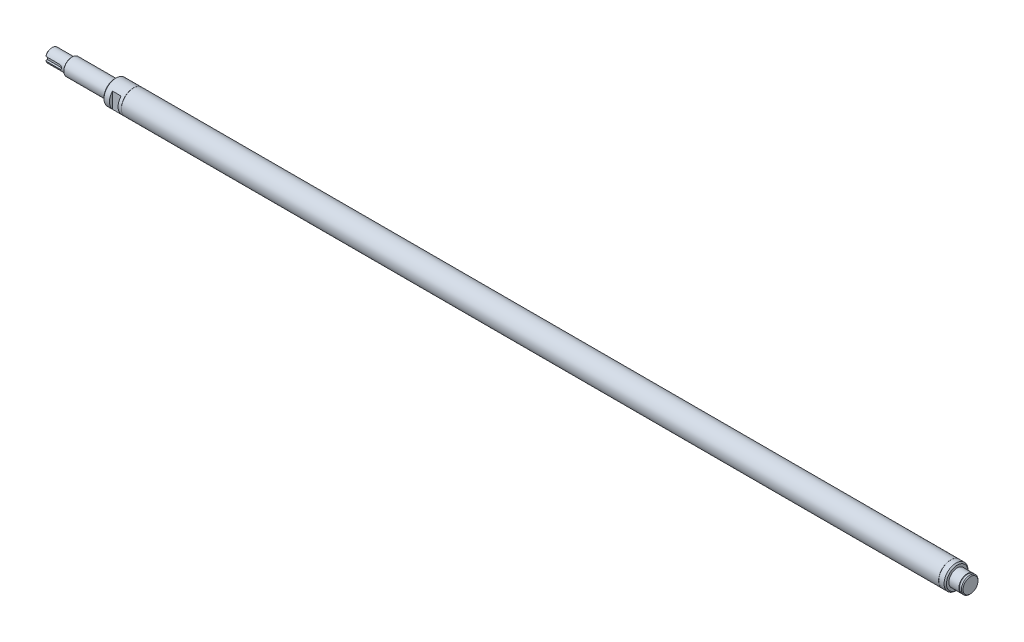
ISO-10303-21;
HEADER;
FILE_DESCRIPTION(('STEP AP214'),'2;1');
FILE_NAME('part.step','',(''),(''),'','','');
FILE_SCHEMA(('AUTOMOTIVE_DESIGN { 1 0 10303 214 1 1 1 1 }'));
ENDSEC;
DATA;
#1=APPLICATION_CONTEXT('core data for automotive mechanical design processes');
#2=APPLICATION_PROTOCOL_DEFINITION('international standard','automotive_design',2000,#1);
#3=PRODUCT_CONTEXT('',#1,'mechanical');
#4=PRODUCT('Part','Part','',(#3));
#5=PRODUCT_RELATED_PRODUCT_CATEGORY('part','',(#4));
#6=PRODUCT_DEFINITION_FORMATION('','',#4);
#7=PRODUCT_DEFINITION_CONTEXT('part definition',#1,'design');
#8=PRODUCT_DEFINITION('design','',#6,#7);
#9=PRODUCT_DEFINITION_SHAPE('','',#8);
#10=(LENGTH_UNIT() NAMED_UNIT(*) SI_UNIT(.MILLI.,.METRE.));
#11=(NAMED_UNIT(*) PLANE_ANGLE_UNIT() SI_UNIT($,.RADIAN.));
#12=(NAMED_UNIT(*) SI_UNIT($,.STERADIAN.) SOLID_ANGLE_UNIT());
#13=UNCERTAINTY_MEASURE_WITH_UNIT(LENGTH_MEASURE(1.E-05),#10,'distance_accuracy_value','');
#14=(GEOMETRIC_REPRESENTATION_CONTEXT(3) GLOBAL_UNCERTAINTY_ASSIGNED_CONTEXT((#13)) GLOBAL_UNIT_ASSIGNED_CONTEXT((#10,
#11,#12)) REPRESENTATION_CONTEXT('',''));
#15=CARTESIAN_POINT('',(0.,0.,0.));
#16=DIRECTION('',(0.,0.,1.));
#17=DIRECTION('',(1.,0.,0.));
#18=AXIS2_PLACEMENT_3D('',#15,#16,#17);
#19=CARTESIAN_POINT('',(1234.,17.9999999999998,0.));
#20=DIRECTION('',(-1.,0.,0.));
#21=DIRECTION('',(0.,-1.,0.));
#22=AXIS2_PLACEMENT_3D('',#19,#20,#21);
#23=PLANE('',#22);
#24=CARTESIAN_POINT('',(1234.,0.,0.));
#25=DIRECTION('',(-1.,0.,0.));
#26=DIRECTION('',(0.,-1.,0.));
#27=AXIS2_PLACEMENT_3D('',#24,#25,#26);
#28=CIRCLE('',#27,17.9999999999998);
#29=CARTESIAN_POINT('',(1234.,-17.9999999999998,0.));
#30=VERTEX_POINT('',#29);
#31=EDGE_CURVE('E281',#30,#30,#28,.T.);
#32=ORIENTED_EDGE('',*,*,#31,.F.);
#33=EDGE_LOOP('',(#32));
#34=FACE_BOUND('',#33,.T.);
#35=CARTESIAN_POINT('',(1234.,0.,0.));
#36=DIRECTION('',(-1.,0.,0.));
#37=DIRECTION('',(0.,-1.,0.));
#38=AXIS2_PLACEMENT_3D('',#35,#36,#37);
#39=CIRCLE('',#38,14.3999999999998);
#40=CARTESIAN_POINT('',(1234.,-14.3999999999998,0.));
#41=VERTEX_POINT('',#40);
#42=EDGE_CURVE('E11',#41,#41,#39,.F.);
#43=ORIENTED_EDGE('',*,*,#42,.F.);
#44=EDGE_LOOP('',(#43));
#45=FACE_BOUND('',#44,.T.);
#46=ADVANCED_FACE('F38',(#34,#45),#23,.F.);
#47=CARTESIAN_POINT('',(5.,0.,0.));
#48=DIRECTION('',(-1.,0.,0.));
#49=DIRECTION('',(0.,-1.,0.));
#50=AXIS2_PLACEMENT_3D('',#47,#48,#49);
#51=CYLINDRICAL_SURFACE('',#50,17.9999999999994);
#52=CARTESIAN_POINT('',(0.,0.,0.));
#53=DIRECTION('',(1.,0.,0.));
#54=DIRECTION('',(0.,0.,-1.));
#55=AXIS2_PLACEMENT_3D('',#52,#53,#54);
#56=CIRCLE('',#55,17.9999999999994);
#57=CARTESIAN_POINT('',(0.,-11.9058808997898,-13.5));
#58=VERTEX_POINT('',#57);
#59=CARTESIAN_POINT('',(0.,11.9058808997898,-13.5));
#60=VERTEX_POINT('',#59);
#61=EDGE_CURVE('E302',#58,#60,#56,.T.);
#62=ORIENTED_EDGE('',*,*,#61,.T.);
#63=DIRECTION('',(-1.,0.,0.));
#64=VECTOR('',#63,1.);
#65=CARTESIAN_POINT('',(5.,11.9058808997898,-13.5));
#66=LINE('',#65,#64);
#67=CARTESIAN_POINT('',(-13.,11.9058808997898,-13.5));
#68=VERTEX_POINT('',#67);
#69=EDGE_CURVE('E233',#60,#68,#66,.T.);
#70=ORIENTED_EDGE('',*,*,#69,.T.);
#71=CARTESIAN_POINT('',(-13.,0.,0.));
#72=DIRECTION('',(-1.,0.,0.));
#73=DIRECTION('',(0.,0.,1.));
#74=AXIS2_PLACEMENT_3D('',#71,#72,#73);
#75=CIRCLE('',#74,17.9999999999994);
#76=CARTESIAN_POINT('',(-13.,-11.9058808997898,-13.5));
#77=VERTEX_POINT('',#76);
#78=EDGE_CURVE('E304',#68,#77,#75,.T.);
#79=ORIENTED_EDGE('',*,*,#78,.T.);
#80=DIRECTION('',(-1.,0.,0.));
#81=VECTOR('',#80,1.);
#82=CARTESIAN_POINT('',(5.,-11.9058808997898,-13.5));
#83=LINE('',#82,#81);
#84=EDGE_CURVE('E299',#77,#58,#83,.F.);
#85=ORIENTED_EDGE('',*,*,#84,.T.);
#86=EDGE_LOOP('',(#62,#70,#79,#85));
#87=FACE_BOUND('',#86,.T.);
#88=CARTESIAN_POINT('',(4.80000000000112,0.,0.));
#89=DIRECTION('',(-1.,0.,0.));
#90=DIRECTION('',(0.,-1.,0.));
#91=AXIS2_PLACEMENT_3D('',#88,#89,#90);
#92=CIRCLE('',#91,17.9999999999989);
#93=CARTESIAN_POINT('',(4.80000000000113,-17.9999999999989,0.));
#94=VERTEX_POINT('',#93);
#95=EDGE_CURVE('E258',#94,#94,#92,.T.);
#96=ORIENTED_EDGE('',*,*,#95,.T.);
#97=EDGE_LOOP('',(#96));
#98=FACE_BOUND('',#97,.T.);
#99=CARTESIAN_POINT('',(-21.1999999999978,0.,0.));
#100=DIRECTION('',(-1.,0.,0.));
#101=DIRECTION('',(0.,-1.,0.));
#102=AXIS2_PLACEMENT_3D('',#99,#100,#101);
#103=CIRCLE('',#102,18.);
#104=CARTESIAN_POINT('',(-21.1999999999978,-18.,0.));
#105=VERTEX_POINT('',#104);
#106=EDGE_CURVE('E261',#105,#105,#103,.T.);
#107=ORIENTED_EDGE('',*,*,#106,.F.);
#108=EDGE_LOOP('',(#107));
#109=FACE_BOUND('',#108,.T.);
#110=DIRECTION('',(-1.,0.,0.));
#111=VECTOR('',#110,1.);
#112=CARTESIAN_POINT('',(5.,11.9058808997898,13.5));
#113=LINE('',#112,#111);
#114=CARTESIAN_POINT('',(0.,11.9058808997898,13.5));
#115=VERTEX_POINT('',#114);
#116=CARTESIAN_POINT('',(-13.,11.9058808997898,13.5));
#117=VERTEX_POINT('',#116);
#118=EDGE_CURVE('E297',#115,#117,#113,.T.);
#119=ORIENTED_EDGE('',*,*,#118,.F.);
#120=CARTESIAN_POINT('',(0.,0.,0.));
#121=DIRECTION('',(-1.,0.,0.));
#122=DIRECTION('',(0.,0.,1.));
#123=AXIS2_PLACEMENT_3D('',#120,#121,#122);
#124=CIRCLE('',#123,17.9999999999994);
#125=CARTESIAN_POINT('',(0.,-11.9058808997898,13.5));
#126=VERTEX_POINT('',#125);
#127=EDGE_CURVE('E292',#126,#115,#124,.T.);
#128=ORIENTED_EDGE('',*,*,#127,.F.);
#129=DIRECTION('',(-1.,0.,0.));
#130=VECTOR('',#129,1.);
#131=CARTESIAN_POINT('',(5.,-11.9058808997898,13.5));
#132=LINE('',#131,#130);
#133=CARTESIAN_POINT('',(-13.,-11.9058808997898,13.5));
#134=VERTEX_POINT('',#133);
#135=EDGE_CURVE('E290',#134,#126,#132,.F.);
#136=ORIENTED_EDGE('',*,*,#135,.F.);
#137=CARTESIAN_POINT('',(-13.,0.,0.));
#138=DIRECTION('',(1.,0.,0.));
#139=DIRECTION('',(0.,0.,-1.));
#140=AXIS2_PLACEMENT_3D('',#137,#138,#139);
#141=CIRCLE('',#140,17.9999999999994);
#142=EDGE_CURVE('E294',#117,#134,#141,.T.);
#143=ORIENTED_EDGE('',*,*,#142,.F.);
#144=EDGE_LOOP('',(#119,#128,#136,#143));
#145=FACE_BOUND('',#144,.T.);
#146=ADVANCED_FACE('F197',(#87,#98,#109,#145),#51,.T.);
#147=CARTESIAN_POINT('',(5.,0.,0.));
#148=DIRECTION('',(1.,0.,0.));
#149=DIRECTION('',(0.,1.,0.));
#150=AXIS2_PLACEMENT_3D('',#147,#148,#149);
#151=PLANE('',#150);
#152=CARTESIAN_POINT('',(4.99999999999989,0.,0.));
#153=DIRECTION('',(-1.,0.,0.));
#154=DIRECTION('',(0.,-1.,0.));
#155=AXIS2_PLACEMENT_3D('',#152,#153,#154);
#156=CIRCLE('',#155,18.);
#157=CARTESIAN_POINT('',(4.99999999999989,-18.,0.));
#158=VERTEX_POINT('',#157);
#159=EDGE_CURVE('E284',#158,#158,#156,.T.);
#160=ORIENTED_EDGE('',*,*,#159,.T.);
#161=EDGE_LOOP('',(#160));
#162=FACE_BOUND('',#161,.T.);
#163=CARTESIAN_POINT('',(5.,0.,0.));
#164=DIRECTION('',(1.,0.,0.));
#165=DIRECTION('',(0.,1.,0.));
#166=AXIS2_PLACEMENT_3D('',#163,#164,#165);
#167=CIRCLE('',#166,14.3999999999994);
#168=CARTESIAN_POINT('',(5.,14.3999999999994,0.));
#169=VERTEX_POINT('',#168);
#170=EDGE_CURVE('E287',#169,#169,#167,.F.);
#171=ORIENTED_EDGE('',*,*,#170,.F.);
#172=EDGE_LOOP('',(#171));
#173=FACE_BOUND('',#172,.T.);
#174=ADVANCED_FACE('F40',(#162,#173),#151,.F.);
#175=CARTESIAN_POINT('',(1234.,0.,0.));
#176=DIRECTION('',(-1.,0.,0.));
#177=DIRECTION('',(0.,-1.,0.));
#178=AXIS2_PLACEMENT_3D('',#175,#176,#177);
#179=CYLINDRICAL_SURFACE('',#178,17.9999999999999);
#180=ORIENTED_EDGE('',*,*,#159,.F.);
#181=EDGE_LOOP('',(#180));
#182=FACE_BOUND('',#181,.T.);
#183=ORIENTED_EDGE('',*,*,#31,.T.);
#184=EDGE_LOOP('',(#183));
#185=FACE_BOUND('',#184,.T.);
#186=ADVANCED_FACE('F324',(#182,#185),#179,.T.);
#187=CARTESIAN_POINT('',(-118.000000000002,0.,0.));
#188=DIRECTION('',(1.,0.,0.));
#189=DIRECTION('',(0.,1.,0.));
#190=AXIS2_PLACEMENT_3D('',#187,#188,#189);
#191=PLANE('',#190);
#192=DIRECTION('',(0.,-1.,0.));
#193=VECTOR('',#192,1.);
#194=CARTESIAN_POINT('',(-118.,3.,6.5));
#195=LINE('',#194,#193);
#196=CARTESIAN_POINT('',(-118.,3.,6.5));
#197=VERTEX_POINT('',#196);
#198=CARTESIAN_POINT('',(-118.,-3.,6.5));
#199=VERTEX_POINT('',#198);
#200=EDGE_CURVE('E118',#197,#199,#195,.T.);
#201=ORIENTED_EDGE('',*,*,#200,.F.);
#202=DIRECTION('',(0.,0.,1.));
#203=VECTOR('',#202,1.);
#204=CARTESIAN_POINT('',(-118.,3.,6.5));
#205=LINE('',#204,#203);
#206=CARTESIAN_POINT('',(-118.,3.,8.36733802825077));
#207=VERTEX_POINT('',#206);
#208=EDGE_CURVE('E147',#197,#207,#205,.T.);
#209=ORIENTED_EDGE('',*,*,#208,.T.);
#210=CARTESIAN_POINT('',(-118.000000000002,0.,0.));
#211=DIRECTION('',(-1.,0.,0.));
#212=DIRECTION('',(0.,-1.,0.));
#213=AXIS2_PLACEMENT_3D('',#210,#211,#212);
#214=CIRCLE('',#213,8.88888888888654);
#215=CARTESIAN_POINT('',(-118.,-3.,8.36733802825077));
#216=VERTEX_POINT('',#215);
#217=EDGE_CURVE('E132',#207,#216,#214,.T.);
#218=ORIENTED_EDGE('',*,*,#217,.T.);
#219=DIRECTION('',(0.,0.,1.));
#220=VECTOR('',#219,1.);
#221=CARTESIAN_POINT('',(-118.,-3.,6.5));
#222=LINE('',#221,#220);
#223=EDGE_CURVE('E111',#199,#216,#222,.T.);
#224=ORIENTED_EDGE('',*,*,#223,.F.);
#225=EDGE_LOOP('',(#201,#209,#218,#224));
#226=FACE_BOUND('',#225,.T.);
#227=ADVANCED_FACE('F130',(#226),#191,.F.);
#228=CARTESIAN_POINT('',(-116.888888888891,0.,0.));
#229=DIRECTION('',(1.,0.,0.));
#230=DIRECTION('',(0.,1.,0.));
#231=AXIS2_PLACEMENT_3D('',#228,#229,#230);
#232=CONICAL_SURFACE('',#231,9.99999999999884,0.78539816339802);
#233=ORIENTED_EDGE('',*,*,#217,.F.);
#234=CARTESIAN_POINT('',(-122.301433868874,3.,3.47055378298792));
#235=CARTESIAN_POINT('',(-122.233637982459,3.,3.56015514887271));
#236=CARTESIAN_POINT('',(-122.165143524152,3.,3.64922274485419));
#237=CARTESIAN_POINT('',(-122.026957526567,3.,3.82641758322849));
#238=CARTESIAN_POINT('',(-121.957266050337,3.,3.9145448747523));
#239=CARTESIAN_POINT('',(-121.746713724879,3.,4.1776856130077));
#240=CARTESIAN_POINT('',(-121.604347418642,3.,4.35149403135238));
#241=CARTESIAN_POINT('',(-121.31674740524,3.,4.69657564049762));
#242=CARTESIAN_POINT('',(-121.171515038886,3.,4.86784995413298));
#243=CARTESIAN_POINT('',(-120.878823791619,3.,5.20849979536973));
#244=CARTESIAN_POINT('',(-120.731364779671,3.,5.37787521019323));
#245=CARTESIAN_POINT('',(-120.434836162513,3.,5.71499954288831));
#246=CARTESIAN_POINT('',(-120.285767743928,3.,5.88274950632426));
#247=CARTESIAN_POINT('',(-119.986280959525,3.,6.21703222021816));
#248=CARTESIAN_POINT('',(-119.835862621178,3.,6.38356499532266));
#249=CARTESIAN_POINT('',(-119.382959558959,3.,6.88173155875715));
#250=CARTESIAN_POINT('',(-119.078859332001,3.,7.21189684245299));
#251=CARTESIAN_POINT('',(-118.674269093058,3.,7.64731917021203));
#252=CARTESIAN_POINT('',(-118.575065784944,3.,7.75377850938818));
#253=CARTESIAN_POINT('',(-118.376387165431,3.,7.96643800302711));
#254=CARTESIAN_POINT('',(-118.276911861484,3.,8.07263816444314));
#255=CARTESIAN_POINT('',(-117.978098154577,3.,8.39091908095395));
#256=CARTESIAN_POINT('',(-117.778394099966,3.,8.60265646402879));
#257=CARTESIAN_POINT('',(-117.169868290049,3.,9.24547502931991));
#258=CARTESIAN_POINT('',(-116.759814813988,3.,9.67538983199232));
#259=CARTESIAN_POINT('',(-115.9375333963,3.,10.5331358627211));
#260=CARTESIAN_POINT('',(-115.525305441711,3.,10.960967078326));
#261=CARTESIAN_POINT('',(-114.699475524459,3.,11.8149776607198));
#262=CARTESIAN_POINT('',(-114.285874160132,3.,12.2411576064799));
#263=CARTESIAN_POINT('',(-113.457528793336,3.,13.092390753848));
#264=CARTESIAN_POINT('',(-113.042784811912,3.,13.517443975929));
#265=CARTESIAN_POINT('',(-112.627657536906,3.,13.9421203435835));
#266=B_SPLINE_CURVE_WITH_KNOTS('',3,(#234,#235,#236,#237,#238,#239,#240,#241,#242,#243,#244,
#245,#246,#247,#248,#249,#250,#251,#252,#253,#254,#255,#256,#257,#258,#259,#260,#261,#262,#263,
#264,#265),.UNSPECIFIED.,.F.,.F.,(4,2,2,2,2,2,2,2,2,2,2,2,2,2,2,4),(0.,0.337069169125226,
0.674120639254204,1.3480873447853,2.02174589564373,2.69544424616791,3.36867584748105,
4.04189377872313,5.38847687775774,5.82502484614318,6.2615609711066,7.13473075334213,
8.91705747662396,10.6993948379637,12.4810373266671,14.2626472170738),.UNSPECIFIED.);
#267=CARTESIAN_POINT('',(-116.888888888891,2.99999999999999,9.53939201416824));
#268=VERTEX_POINT('',#267);
#269=EDGE_CURVE('E146',#207,#268,#266,.T.);
#270=ORIENTED_EDGE('',*,*,#269,.T.);
#271=CARTESIAN_POINT('',(-116.888888888891,0.,0.));
#272=DIRECTION('',(-1.,0.,0.));
#273=DIRECTION('',(0.,-1.,0.));
#274=AXIS2_PLACEMENT_3D('',#271,#272,#273);
#275=CIRCLE('',#274,9.99999999999884);
#276=CARTESIAN_POINT('',(-116.888888888891,-3.00000000000001,9.53939201416824));
#277=VERTEX_POINT('',#276);
#278=EDGE_CURVE('E239',#268,#277,#275,.T.);
#279=ORIENTED_EDGE('',*,*,#278,.T.);
#280=CARTESIAN_POINT('',(-112.627657536906,-3.,13.9421203435835));
#281=CARTESIAN_POINT('',(-113.042986809198,-3.,13.517237210004));
#282=CARTESIAN_POINT('',(-113.457932506245,-3.,13.0919769304673));
#283=CARTESIAN_POINT('',(-114.286644955934,-3.,12.2403644266343));
#284=CARTESIAN_POINT('',(-114.700411784913,-3.,11.8140122766004));
#285=CARTESIAN_POINT('',(-115.52620513287,-3.,10.9600338708438));
#286=CARTESIAN_POINT('',(-115.938232412916,-3.,10.5324083515427));
#287=CARTESIAN_POINT('',(-116.760146888956,-3.,9.67504176379707));
#288=CARTESIAN_POINT('',(-117.17003392678,-3.,9.24530054343216));
#289=CARTESIAN_POINT('',(-117.782593055062,-3.,8.5982206390231));
#290=CARTESIAN_POINT('',(-117.986479439667,-3.,8.38203172398747));
#291=CARTESIAN_POINT('',(-118.393231215041,-3.,7.94869819291183));
#292=CARTESIAN_POINT('',(-118.596096614373,-3.,7.73155358491674));
#293=CARTESIAN_POINT('',(-119.000502982342,-3.,7.29610515910706));
#294=CARTESIAN_POINT('',(-119.202044179183,-3.,7.07780155340987));
#295=CARTESIAN_POINT('',(-119.603468029653,-3.,6.63965944595411));
#296=CARTESIAN_POINT('',(-119.803350629534,-3.,6.41982089487572));
#297=CARTESIAN_POINT('',(-120.201047880355,-3.,5.97800054560932));
#298=CARTESIAN_POINT('',(-120.398860989389,-3.,5.75601735768409));
#299=CARTESIAN_POINT('',(-120.791466836103,-3.,5.30941965811222));
#300=CARTESIAN_POINT('',(-120.986259843503,-3.,5.08480538462395));
#301=CARTESIAN_POINT('',(-121.275304610894,-3.,4.7450859998778));
#302=CARTESIAN_POINT('',(-121.371158099259,-3.,4.63134402289222));
#303=CARTESIAN_POINT('',(-121.561559408686,-3.,4.40277642444912));
#304=CARTESIAN_POINT('',(-121.656107265782,-3.,4.28795083304505));
#305=CARTESIAN_POINT('',(-121.84364658849,-3.,4.05697431863918));
#306=CARTESIAN_POINT('',(-121.936637576978,-3.,3.94082300705062));
#307=CARTESIAN_POINT('',(-122.120631802318,-3.,3.70694029463995));
#308=CARTESIAN_POINT('',(-122.211634847985,-3.,3.58920874358695));
#309=CARTESIAN_POINT('',(-122.301433868874,-3.,3.47055378298794));
#310=B_SPLINE_CURVE_WITH_KNOTS('',3,(#280,#281,#282,#283,#284,#285,#286,#287,#288,#289,#290,
#291,#292,#293,#294,#295,#296,#297,#298,#299,#300,#301,#302,#303,#304,#305,#306,#307,#308,#309),
.UNSPECIFIED.,.F.,.F.,(4,2,2,2,2,2,2,2,2,2,2,2,2,2,4),(0.,1.78247708848247,3.56483600301194,
5.34631131319019,7.12791646642009,8.01941034859106,8.91089674056603,9.8022252425689,
10.6935825171539,11.5855623751087,12.4774621080877,12.923689952914,13.3699054580179,
13.8162552971707,14.2626478749594),.UNSPECIFIED.);
#311=EDGE_CURVE('E53',#277,#216,#310,.T.);
#312=ORIENTED_EDGE('',*,*,#311,.T.);
#313=EDGE_LOOP('',(#233,#270,#279,#312));
#314=FACE_BOUND('',#313,.T.);
#315=ADVANCED_FACE('F154',(#314),#232,.T.);
#316=CARTESIAN_POINT('',(5.,0.,0.));
#317=DIRECTION('',(-1.,0.,0.));
#318=DIRECTION('',(0.,-1.,0.));
#319=AXIS2_PLACEMENT_3D('',#316,#317,#318);
#320=CYLINDRICAL_SURFACE('',#319,9.99999999999884);
#321=ORIENTED_EDGE('',*,*,#278,.F.);
#322=DIRECTION('',(-1.,0.,0.));
#323=VECTOR('',#322,1.);
#324=CARTESIAN_POINT('',(5.,3.,9.53939201416824));
#325=LINE('',#324,#323);
#326=CARTESIAN_POINT('',(-96.,3.,9.53939201416824));
#327=VERTEX_POINT('',#326);
#328=EDGE_CURVE('E46',#268,#327,#325,.F.);
#329=ORIENTED_EDGE('',*,*,#328,.T.);
#330=CARTESIAN_POINT('',(-96.,3.,9.53939201416824));
#331=CARTESIAN_POINT('',(-95.9176644791773,3.00001027845728,9.53938054248085));
#332=CARTESIAN_POINT('',(-95.8353355449368,2.99661062684472,9.54045772064257));
#333=CARTESIAN_POINT('',(-95.6713060472345,2.98307142899347,9.54470412105864));
#334=CARTESIAN_POINT('',(-95.5896053466756,2.97293339805418,9.54787287296727));
#335=CARTESIAN_POINT('',(-95.4276150843268,2.94603140625045,9.55620668350882));
#336=CARTESIAN_POINT('',(-95.347322475957,2.92928426957737,9.56136667249993));
#337=CARTESIAN_POINT('',(-95.1885241558658,2.88932853030395,9.57351626651057));
#338=CARTESIAN_POINT('',(-95.1100184909326,2.86611975872641,9.58050591937706));
#339=CARTESIAN_POINT('',(-94.8780506120099,2.78708584446025,9.60391637654015));
#340=CARTESIAN_POINT('',(-94.727931561167,2.72181852542973,9.6227900783027));
#341=CARTESIAN_POINT('',(-94.440773956021,2.56815043531277,9.66493213967699));
#342=CARTESIAN_POINT('',(-94.3037415292378,2.47973889924161,9.68820254290521));
#343=CARTESIAN_POINT('',(-94.0422770120522,2.27929879634444,9.73733650515255));
#344=CARTESIAN_POINT('',(-93.9183151259391,2.16666914746586,9.76325505469754));
#345=CARTESIAN_POINT('',(-93.6907263851613,1.92227736150435,9.81429628474958));
#346=CARTESIAN_POINT('',(-93.587102966139,1.79051199848166,9.83941883019291));
#347=CARTESIAN_POINT('',(-93.4010731349054,1.50821997465699,9.88666477976416));
#348=CARTESIAN_POINT('',(-93.3191498202174,1.35736167401018,9.9087154154676));
#349=CARTESIAN_POINT('',(-93.1820229959971,1.04324233568305,9.94668940088027));
#350=CARTESIAN_POINT('',(-93.1268125966321,0.879984508688006,9.96261433032286));
#351=CARTESIAN_POINT('',(-93.046240448209,0.55064940482062,9.98615279768281));
#352=CARTESIAN_POINT('',(-93.0200702964824,0.384786253016223,9.99399098526676));
#353=CARTESIAN_POINT('',(-92.995765304854,0.0508471415689486,10.0012640407192));
#354=CARTESIAN_POINT('',(-92.9976251573218,-0.117228393125318,10.0007004995));
#355=CARTESIAN_POINT('',(-93.0287858206914,-0.445143199271803,9.9913920512547));
#356=CARTESIAN_POINT('',(-93.0572106908081,-0.605074290763005,9.98290831016396));
#357=CARTESIAN_POINT('',(-93.1392632696255,-0.91778010437029,9.95903027401706));
#358=CARTESIAN_POINT('',(-93.1928922986827,-1.07055445110876,9.94363561692442));
#359=CARTESIAN_POINT('',(-93.3244244435247,-1.36669563173909,9.90730429851665));
#360=CARTESIAN_POINT('',(-93.4026032887761,-1.5099320120761,9.88630511384798));
#361=CARTESIAN_POINT('',(-93.5807971800344,-1.78153105916097,9.8409924930353));
#362=CARTESIAN_POINT('',(-93.6808171189407,-1.90989038323248,9.81667831471689));
#363=CARTESIAN_POINT('',(-93.9043839761846,-2.15330901082203,9.76623347142662));
#364=CARTESIAN_POINT('',(-94.0286877275262,-2.26766702955973,9.74006890898979));
#365=CARTESIAN_POINT('',(-94.2949948468511,-2.47413538985065,9.68968430229208));
#366=CARTESIAN_POINT('',(-94.4370033607297,-2.56623924026178,9.66546482675015));
#367=CARTESIAN_POINT('',(-94.7365618568998,-2.726328144817,9.62154457591183));
#368=CARTESIAN_POINT('',(-94.8942543591871,-2.79406012682261,9.60189192491775));
#369=CARTESIAN_POINT('',(-95.2194490079631,-2.90171772009403,9.56991327306282));
#370=CARTESIAN_POINT('',(-95.3869357214286,-2.94168586436071,9.55757606951629));
#371=CARTESIAN_POINT('',(-95.6299897781404,-2.97802407180158,9.54628064649891));
#372=CARTESIAN_POINT('',(-95.7037814683592,-2.98626405978017,9.54370312550412));
#373=CARTESIAN_POINT('',(-95.851702958199,-2.99724711229708,9.54025857223443));
#374=CARTESIAN_POINT('',(-95.9258320993277,-2.99999825936538,9.53938902493167));
#375=CARTESIAN_POINT('',(-96.,-3.,9.53939201416824));
#376=B_SPLINE_CURVE_WITH_KNOTS('',3,(#330,#331,#332,#333,#334,#335,#336,#337,#338,#339,#340,
#341,#342,#343,#344,#345,#346,#347,#348,#349,#350,#351,#352,#353,#354,#355,#356,#357,#358,#359,
#360,#361,#362,#363,#364,#365,#366,#367,#368,#369,#370,#371,#372,#373,#374,#375),.UNSPECIFIED.,
.F.,.F.,(4,2,2,2,2,2,2,2,2,2,2,2,2,2,2,2,2,2,2,2,2,2,4),(0.,0.246918142439488,0.493780777706094,
0.740019009623012,0.986263681482012,1.47813347402023,1.97023245590777,2.47635119822765,
2.98255536239031,3.49922810620069,4.01576751791671,4.51753600864763,5.01920948804099,
5.50490358251091,5.9906231236083,6.48200583350619,6.97349873739167,7.4838923484712,
7.99443465298712,8.51013494368211,9.02504345105571,9.24774267716779,9.47011372732393),.UNSPECIFIED.);
#377=CARTESIAN_POINT('',(-96.,-3.,9.53939201416824));
#378=VERTEX_POINT('',#377);
#379=EDGE_CURVE('E224',#327,#378,#376,.T.);
#380=ORIENTED_EDGE('',*,*,#379,.T.);
#381=DIRECTION('',(-1.,0.,0.));
#382=VECTOR('',#381,1.);
#383=CARTESIAN_POINT('',(5.,-3.,9.53939201416824));
#384=LINE('',#383,#382);
#385=EDGE_CURVE('E232',#378,#277,#384,.T.);
#386=ORIENTED_EDGE('',*,*,#385,.T.);
#387=EDGE_LOOP('',(#321,#329,#380,#386));
#388=FACE_BOUND('',#387,.T.);
#389=CARTESIAN_POINT('',(-87.9999999999968,0.,0.));
#390=DIRECTION('',(-1.,0.,0.));
#391=DIRECTION('',(0.,-1.,0.));
#392=AXIS2_PLACEMENT_3D('',#389,#390,#391);
#393=CIRCLE('',#392,9.99999999999884);
#394=CARTESIAN_POINT('',(-87.9999999999968,-9.99999999999885,0.));
#395=VERTEX_POINT('',#394);
#396=EDGE_CURVE('E276',#395,#395,#393,.T.);
#397=ORIENTED_EDGE('',*,*,#396,.T.);
#398=EDGE_LOOP('',(#397));
#399=FACE_BOUND('',#398,.T.);
#400=ADVANCED_FACE('F218',(#388,#399),#320,.T.);
#401=CARTESIAN_POINT('',(-87.9999999999968,9.99999999999883,0.));
#402=DIRECTION('',(1.,0.,0.));
#403=DIRECTION('',(0.,1.,0.));
#404=AXIS2_PLACEMENT_3D('',#401,#402,#403);
#405=PLANE('',#404);
#406=ORIENTED_EDGE('',*,*,#396,.F.);
#407=EDGE_LOOP('',(#406));
#408=FACE_BOUND('',#407,.T.);
#409=CARTESIAN_POINT('',(-87.9999999999968,0.,0.));
#410=DIRECTION('',(-1.,0.,0.));
#411=DIRECTION('',(0.,-1.,0.));
#412=AXIS2_PLACEMENT_3D('',#409,#410,#411);
#413=CIRCLE('',#412,11.5799999999989);
#414=CARTESIAN_POINT('',(-87.9999999999968,-11.5799999999989,0.));
#415=VERTEX_POINT('',#414);
#416=EDGE_CURVE('E273',#415,#415,#413,.T.);
#417=ORIENTED_EDGE('',*,*,#416,.T.);
#418=EDGE_LOOP('',(#417));
#419=FACE_BOUND('',#418,.T.);
#420=ADVANCED_FACE('F215',(#408,#419),#405,.F.);
#421=CARTESIAN_POINT('',(-87.0800000000017,0.,0.));
#422=DIRECTION('',(1.,0.,0.));
#423=DIRECTION('',(0.,1.,0.));
#424=AXIS2_PLACEMENT_3D('',#421,#422,#423);
#425=CONICAL_SURFACE('',#424,12.4999999999955,0.785398163398253);
#426=ORIENTED_EDGE('',*,*,#416,.F.);
#427=EDGE_LOOP('',(#426));
#428=FACE_BOUND('',#427,.T.);
#429=CARTESIAN_POINT('',(-87.0800000000017,0.,0.));
#430=DIRECTION('',(-1.,0.,0.));
#431=DIRECTION('',(0.,-1.,0.));
#432=AXIS2_PLACEMENT_3D('',#429,#430,#431);
#433=CIRCLE('',#432,12.4999999999955);
#434=CARTESIAN_POINT('',(-87.0800000000017,-12.4999999999955,0.));
#435=VERTEX_POINT('',#434);
#436=EDGE_CURVE('E270',#435,#435,#433,.T.);
#437=ORIENTED_EDGE('',*,*,#436,.T.);
#438=EDGE_LOOP('',(#437));
#439=FACE_BOUND('',#438,.T.);
#440=ADVANCED_FACE('F211',(#428,#439),#425,.T.);
#441=CARTESIAN_POINT('',(5.,0.,0.));
#442=DIRECTION('',(-1.,0.,0.));
#443=DIRECTION('',(0.,-1.,0.));
#444=AXIS2_PLACEMENT_3D('',#441,#442,#443);
#445=CYLINDRICAL_SURFACE('',#444,12.4999999999958);
#446=ORIENTED_EDGE('',*,*,#436,.F.);
#447=EDGE_LOOP('',(#446));
#448=FACE_BOUND('',#447,.T.);
#449=CARTESIAN_POINT('',(-22.9999999999972,0.,0.));
#450=DIRECTION('',(-1.,0.,0.));
#451=DIRECTION('',(0.,-1.,0.));
#452=AXIS2_PLACEMENT_3D('',#449,#450,#451);
#453=CIRCLE('',#452,12.4999999999961);
#454=CARTESIAN_POINT('',(-22.9999999999972,-12.4999999999961,0.));
#455=VERTEX_POINT('',#454);
#456=EDGE_CURVE('E267',#455,#455,#453,.T.);
#457=ORIENTED_EDGE('',*,*,#456,.T.);
#458=EDGE_LOOP('',(#457));
#459=FACE_BOUND('',#458,.T.);
#460=ADVANCED_FACE('F207',(#448,#459),#445,.T.);
#461=CARTESIAN_POINT('',(-22.9999999999972,12.4999999999961,0.));
#462=DIRECTION('',(1.,0.,0.));
#463=DIRECTION('',(0.,1.,0.));
#464=AXIS2_PLACEMENT_3D('',#461,#462,#463);
#465=PLANE('',#464);
#466=ORIENTED_EDGE('',*,*,#456,.F.);
#467=EDGE_LOOP('',(#466));
#468=FACE_BOUND('',#467,.T.);
#469=CARTESIAN_POINT('',(-22.9999999999972,0.,0.));
#470=DIRECTION('',(-1.,0.,0.));
#471=DIRECTION('',(0.,-1.,0.));
#472=AXIS2_PLACEMENT_3D('',#469,#470,#471);
#473=CIRCLE('',#472,16.2000000000017);
#474=CARTESIAN_POINT('',(-22.9999999999972,-16.2000000000017,0.));
#475=VERTEX_POINT('',#474);
#476=EDGE_CURVE('E264',#475,#475,#473,.T.);
#477=ORIENTED_EDGE('',*,*,#476,.T.);
#478=EDGE_LOOP('',(#477));
#479=FACE_BOUND('',#478,.T.);
#480=ADVANCED_FACE('F203',(#468,#479),#465,.F.);
#481=CARTESIAN_POINT('',(-21.1999999999978,0.,0.));
#482=DIRECTION('',(1.,0.,0.));
#483=DIRECTION('',(0.,1.,0.));
#484=AXIS2_PLACEMENT_3D('',#481,#482,#483);
#485=CONICAL_SURFACE('',#484,18.,0.785398163397145);
#486=ORIENTED_EDGE('',*,*,#476,.F.);
#487=EDGE_LOOP('',(#486));
#488=FACE_BOUND('',#487,.T.);
#489=ORIENTED_EDGE('',*,*,#106,.T.);
#490=EDGE_LOOP('',(#489));
#491=FACE_BOUND('',#490,.T.);
#492=ADVANCED_FACE('F195',(#488,#491),#485,.T.);
#493=CARTESIAN_POINT('',(4.80000000000112,17.9999999999989,0.));
#494=DIRECTION('',(-1.,0.,0.));
#495=DIRECTION('',(0.,-1.,0.));
#496=AXIS2_PLACEMENT_3D('',#493,#494,#495);
#497=PLANE('',#496);
#498=ORIENTED_EDGE('',*,*,#95,.F.);
#499=EDGE_LOOP('',(#498));
#500=FACE_BOUND('',#499,.T.);
#501=CARTESIAN_POINT('',(4.80000000000112,0.,0.));
#502=DIRECTION('',(-1.,0.,0.));
#503=DIRECTION('',(0.,-1.,0.));
#504=AXIS2_PLACEMENT_3D('',#501,#502,#503);
#505=CIRCLE('',#504,14.3999999999989);
#506=CARTESIAN_POINT('',(4.80000000000113,-14.3999999999989,0.));
#507=VERTEX_POINT('',#506);
#508=EDGE_CURVE('E255',#507,#507,#505,.T.);
#509=ORIENTED_EDGE('',*,*,#508,.T.);
#510=EDGE_LOOP('',(#509));
#511=FACE_BOUND('',#510,.T.);
#512=ADVANCED_FACE('F191',(#500,#511),#497,.F.);
#513=CARTESIAN_POINT('',(5.,0.,0.));
#514=DIRECTION('',(-1.,0.,0.));
#515=DIRECTION('',(0.,-1.,0.));
#516=AXIS2_PLACEMENT_3D('',#513,#514,#515);
#517=CYLINDRICAL_SURFACE('',#516,14.3999999999994);
#518=ORIENTED_EDGE('',*,*,#508,.F.);
#519=EDGE_LOOP('',(#518));
#520=FACE_BOUND('',#519,.T.);
#521=ORIENTED_EDGE('',*,*,#170,.T.);
#522=EDGE_LOOP('',(#521));
#523=FACE_BOUND('',#522,.T.);
#524=ADVANCED_FACE('F187',(#520,#523),#517,.T.);
#525=CARTESIAN_POINT('',(-13.,18.,22.5));
#526=DIRECTION('',(1.,0.,0.));
#527=DIRECTION('',(0.,0.,-1.));
#528=AXIS2_PLACEMENT_3D('',#525,#526,#527);
#529=PLANE('',#528);
#530=ORIENTED_EDGE('',*,*,#142,.T.);
#531=DIRECTION('',(0.,-1.,0.));
#532=VECTOR('',#531,1.);
#533=CARTESIAN_POINT('',(-13.,18.,13.5));
#534=LINE('',#533,#532);
#535=EDGE_CURVE('E248',#117,#134,#534,.T.);
#536=ORIENTED_EDGE('',*,*,#535,.F.);
#537=EDGE_LOOP('',(#530,#536));
#538=FACE_BOUND('',#537,.T.);
#539=ADVANCED_FACE('F183',(#538),#529,.T.);
#540=CARTESIAN_POINT('',(0.,-18.,22.5));
#541=DIRECTION('',(-1.,0.,0.));
#542=DIRECTION('',(0.,0.,1.));
#543=AXIS2_PLACEMENT_3D('',#540,#541,#542);
#544=PLANE('',#543);
#545=ORIENTED_EDGE('',*,*,#127,.T.);
#546=DIRECTION('',(0.,1.,0.));
#547=VECTOR('',#546,1.);
#548=CARTESIAN_POINT('',(0.,-18.,13.5));
#549=LINE('',#548,#547);
#550=EDGE_CURVE('E252',#126,#115,#549,.T.);
#551=ORIENTED_EDGE('',*,*,#550,.F.);
#552=EDGE_LOOP('',(#545,#551));
#553=FACE_BOUND('',#552,.T.);
#554=ADVANCED_FACE('F179',(#553),#544,.T.);
#555=CARTESIAN_POINT('',(0.,0.,13.5));
#556=DIRECTION('',(0.,0.,1.));
#557=DIRECTION('',(1.,0.,0.));
#558=AXIS2_PLACEMENT_3D('',#555,#556,#557);
#559=PLANE('',#558);
#560=ORIENTED_EDGE('',*,*,#118,.T.);
#561=ORIENTED_EDGE('',*,*,#535,.T.);
#562=ORIENTED_EDGE('',*,*,#135,.T.);
#563=ORIENTED_EDGE('',*,*,#550,.T.);
#564=EDGE_LOOP('',(#560,#561,#562,#563));
#565=FACE_BOUND('',#564,.T.);
#566=ADVANCED_FACE('F175',(#565),#559,.T.);
#567=CARTESIAN_POINT('',(-13.,18.,-22.5));
#568=DIRECTION('',(-1.,0.,0.));
#569=DIRECTION('',(0.,0.,1.));
#570=AXIS2_PLACEMENT_3D('',#567,#568,#569);
#571=PLANE('',#570);
#572=DIRECTION('',(0.,-1.,0.));
#573=VECTOR('',#572,1.);
#574=CARTESIAN_POINT('',(-13.,18.,-13.5));
#575=LINE('',#574,#573);
#576=EDGE_CURVE('E244',#68,#77,#575,.T.);
#577=ORIENTED_EDGE('',*,*,#576,.T.);
#578=ORIENTED_EDGE('',*,*,#78,.F.);
#579=EDGE_LOOP('',(#577,#578));
#580=FACE_BOUND('',#579,.T.);
#581=ADVANCED_FACE('F171',(#580),#571,.F.);
#582=CARTESIAN_POINT('',(0.,-18.,-22.5));
#583=DIRECTION('',(1.,0.,0.));
#584=DIRECTION('',(0.,0.,-1.));
#585=AXIS2_PLACEMENT_3D('',#582,#583,#584);
#586=PLANE('',#585);
#587=DIRECTION('',(0.,1.,0.));
#588=VECTOR('',#587,1.);
#589=CARTESIAN_POINT('',(0.,-18.,-13.5));
#590=LINE('',#589,#588);
#591=EDGE_CURVE('E61',#58,#60,#590,.T.);
#592=ORIENTED_EDGE('',*,*,#591,.T.);
#593=ORIENTED_EDGE('',*,*,#61,.F.);
#594=EDGE_LOOP('',(#592,#593));
#595=FACE_BOUND('',#594,.T.);
#596=ADVANCED_FACE('F168',(#595),#586,.F.);
#597=CARTESIAN_POINT('',(0.,0.,-13.5));
#598=DIRECTION('',(0.,0.,1.));
#599=DIRECTION('',(1.,0.,0.));
#600=AXIS2_PLACEMENT_3D('',#597,#598,#599);
#601=PLANE('',#600);
#602=ORIENTED_EDGE('',*,*,#591,.F.);
#603=ORIENTED_EDGE('',*,*,#84,.F.);
#604=ORIENTED_EDGE('',*,*,#576,.F.);
#605=ORIENTED_EDGE('',*,*,#69,.F.);
#606=EDGE_LOOP('',(#602,#603,#604,#605));
#607=FACE_BOUND('',#606,.T.);
#608=ADVANCED_FACE('F164',(#607),#601,.F.);
#609=CARTESIAN_POINT('',(-96.,3.,6.5));
#610=DIRECTION('',(0.,1.,0.));
#611=DIRECTION('',(0.,0.,1.));
#612=AXIS2_PLACEMENT_3D('',#609,#610,#611);
#613=PLANE('',#612);
#614=ORIENTED_EDGE('',*,*,#208,.F.);
#615=DIRECTION('',(-1.,0.,0.));
#616=VECTOR('',#615,1.);
#617=CARTESIAN_POINT('',(-96.,3.,6.5));
#618=LINE('',#617,#616);
#619=CARTESIAN_POINT('',(-96.,3.,6.5));
#620=VERTEX_POINT('',#619);
#621=EDGE_CURVE('E124',#620,#197,#618,.T.);
#622=ORIENTED_EDGE('',*,*,#621,.F.);
#623=DIRECTION('',(0.,0.,1.));
#624=VECTOR('',#623,1.);
#625=CARTESIAN_POINT('',(-96.,3.,6.5));
#626=LINE('',#625,#624);
#627=EDGE_CURVE('E134',#620,#327,#626,.T.);
#628=ORIENTED_EDGE('',*,*,#627,.T.);
#629=ORIENTED_EDGE('',*,*,#328,.F.);
#630=ORIENTED_EDGE('',*,*,#269,.F.);
#631=EDGE_LOOP('',(#614,#622,#628,#629,#630));
#632=FACE_BOUND('',#631,.T.);
#633=ADVANCED_FACE('F167',(#632),#613,.F.);
#634=CARTESIAN_POINT('',(-96.,0.,6.5));
#635=DIRECTION('',(0.,0.,1.));
#636=DIRECTION('',(1.,0.,0.));
#637=AXIS2_PLACEMENT_3D('',#634,#635,#636);
#638=CYLINDRICAL_SURFACE('',#637,3.);
#639=ORIENTED_EDGE('',*,*,#627,.F.);
#640=CARTESIAN_POINT('',(-96.,0.,6.5));
#641=DIRECTION('',(0.,0.,1.));
#642=DIRECTION('',(1.,0.,0.));
#643=AXIS2_PLACEMENT_3D('',#640,#641,#642);
#644=CIRCLE('',#643,3.);
#645=CARTESIAN_POINT('',(-96.,-3.,6.5));
#646=VERTEX_POINT('',#645);
#647=EDGE_CURVE('E117',#646,#620,#644,.T.);
#648=ORIENTED_EDGE('',*,*,#647,.F.);
#649=DIRECTION('',(0.,0.,1.));
#650=VECTOR('',#649,1.);
#651=CARTESIAN_POINT('',(-96.,-3.,6.5));
#652=LINE('',#651,#650);
#653=EDGE_CURVE('E113',#646,#378,#652,.T.);
#654=ORIENTED_EDGE('',*,*,#653,.T.);
#655=ORIENTED_EDGE('',*,*,#379,.F.);
#656=EDGE_LOOP('',(#639,#648,#654,#655));
#657=FACE_BOUND('',#656,.T.);
#658=ADVANCED_FACE('F162',(#657),#638,.F.);
#659=CARTESIAN_POINT('',(-118.,-3.,6.5));
#660=DIRECTION('',(0.,-1.,0.));
#661=DIRECTION('',(0.,0.,-1.));
#662=AXIS2_PLACEMENT_3D('',#659,#660,#661);
#663=PLANE('',#662);
#664=ORIENTED_EDGE('',*,*,#385,.F.);
#665=ORIENTED_EDGE('',*,*,#653,.F.);
#666=DIRECTION('',(1.,0.,0.));
#667=VECTOR('',#666,1.);
#668=CARTESIAN_POINT('',(-118.,-3.,6.5));
#669=LINE('',#668,#667);
#670=EDGE_CURVE('E107',#199,#646,#669,.T.);
#671=ORIENTED_EDGE('',*,*,#670,.F.);
#672=ORIENTED_EDGE('',*,*,#223,.T.);
#673=ORIENTED_EDGE('',*,*,#311,.F.);
#674=EDGE_LOOP('',(#664,#665,#671,#672,#673));
#675=FACE_BOUND('',#674,.T.);
#676=ADVANCED_FACE('F109',(#675),#663,.F.);
#677=CARTESIAN_POINT('',(-96.,0.,6.5));
#678=DIRECTION('',(0.,0.,1.));
#679=DIRECTION('',(1.,0.,0.));
#680=AXIS2_PLACEMENT_3D('',#677,#678,#679);
#681=PLANE('',#680);
#682=ORIENTED_EDGE('',*,*,#200,.T.);
#683=ORIENTED_EDGE('',*,*,#670,.T.);
#684=ORIENTED_EDGE('',*,*,#647,.T.);
#685=ORIENTED_EDGE('',*,*,#621,.T.);
#686=EDGE_LOOP('',(#682,#683,#684,#685));
#687=FACE_BOUND('',#686,.T.);
#688=ADVANCED_FACE('F122',(#687),#681,.T.);
#689=CARTESIAN_POINT('',(1264.,0.,0.));
#690=DIRECTION('',(-1.,0.,0.));
#691=DIRECTION('',(0.,-1.,0.));
#692=AXIS2_PLACEMENT_3D('',#689,#690,#691);
#693=CYLINDRICAL_SURFACE('',#692,14.3999999999998);
#694=ORIENTED_EDGE('',*,*,#42,.T.);
#695=EDGE_LOOP('',(#694));
#696=FACE_BOUND('',#695,.T.);
#697=CARTESIAN_POINT('',(1234.2,0.,0.));
#698=DIRECTION('',(-1.,0.,0.));
#699=DIRECTION('',(0.,-1.,0.));
#700=AXIS2_PLACEMENT_3D('',#697,#698,#699);
#701=CIRCLE('',#700,14.3999999999998);
#702=CARTESIAN_POINT('',(1234.2,-14.3999999999998,0.));
#703=VERTEX_POINT('',#702);
#704=EDGE_CURVE('E127',#703,#703,#701,.T.);
#705=ORIENTED_EDGE('',*,*,#704,.T.);
#706=EDGE_LOOP('',(#705));
#707=FACE_BOUND('',#706,.T.);
#708=ADVANCED_FACE('F422',(#696,#707),#693,.T.);
#709=CARTESIAN_POINT('',(1234.2,14.3999999999998,0.));
#710=DIRECTION('',(1.,0.,0.));
#711=DIRECTION('',(0.,1.,0.));
#712=AXIS2_PLACEMENT_3D('',#709,#710,#711);
#713=PLANE('',#712);
#714=ORIENTED_EDGE('',*,*,#704,.F.);
#715=EDGE_LOOP('',(#714));
#716=FACE_BOUND('',#715,.T.);
#717=CARTESIAN_POINT('',(1234.2,0.,0.));
#718=DIRECTION('',(-1.,0.,0.));
#719=DIRECTION('',(0.,-1.,0.));
#720=AXIS2_PLACEMENT_3D('',#717,#718,#719);
#721=CIRCLE('',#720,17.9999999999998);
#722=CARTESIAN_POINT('',(1234.2,-17.9999999999998,0.));
#723=VERTEX_POINT('',#722);
#724=EDGE_CURVE('E641',#723,#723,#721,.T.);
#725=ORIENTED_EDGE('',*,*,#724,.T.);
#726=EDGE_LOOP('',(#725));
#727=FACE_BOUND('',#726,.T.);
#728=ADVANCED_FACE('F429',(#716,#727),#713,.F.);
#729=CARTESIAN_POINT('',(1264.,0.,0.));
#730=DIRECTION('',(-1.,0.,0.));
#731=DIRECTION('',(0.,-1.,0.));
#732=AXIS2_PLACEMENT_3D('',#729,#730,#731);
#733=CYLINDRICAL_SURFACE('',#732,17.9999999999998);
#734=ORIENTED_EDGE('',*,*,#724,.F.);
#735=EDGE_LOOP('',(#734));
#736=FACE_BOUND('',#735,.T.);
#737=CARTESIAN_POINT('',(1242.2,0.,0.));
#738=DIRECTION('',(-1.,0.,0.));
#739=DIRECTION('',(0.,-1.,0.));
#740=AXIS2_PLACEMENT_3D('',#737,#738,#739);
#741=CIRCLE('',#740,17.9999999999998);
#742=CARTESIAN_POINT('',(1242.2,-17.9999999999998,0.));
#743=VERTEX_POINT('',#742);
#744=EDGE_CURVE('E638',#743,#743,#741,.T.);
#745=ORIENTED_EDGE('',*,*,#744,.T.);
#746=EDGE_LOOP('',(#745));
#747=FACE_BOUND('',#746,.T.);
#748=ADVANCED_FACE('F437',(#736,#747),#733,.T.);
#749=CARTESIAN_POINT('',(1244.,0.,0.));
#750=DIRECTION('',(-1.,0.,0.));
#751=DIRECTION('',(0.,-1.,0.));
#752=AXIS2_PLACEMENT_3D('',#749,#750,#751);
#753=CONICAL_SURFACE('',#752,16.1999999999998,0.785398163397442);
#754=ORIENTED_EDGE('',*,*,#744,.F.);
#755=EDGE_LOOP('',(#754));
#756=FACE_BOUND('',#755,.T.);
#757=CARTESIAN_POINT('',(1244.,0.,0.));
#758=DIRECTION('',(-1.,0.,0.));
#759=DIRECTION('',(0.,-1.,0.));
#760=AXIS2_PLACEMENT_3D('',#757,#758,#759);
#761=CIRCLE('',#760,16.1999999999998);
#762=CARTESIAN_POINT('',(1244.,-16.1999999999998,0.));
#763=VERTEX_POINT('',#762);
#764=EDGE_CURVE('E635',#763,#763,#761,.T.);
#765=ORIENTED_EDGE('',*,*,#764,.T.);
#766=EDGE_LOOP('',(#765));
#767=FACE_BOUND('',#766,.T.);
#768=ADVANCED_FACE('F445',(#756,#767),#753,.T.);
#769=CARTESIAN_POINT('',(1244.,16.1999999999998,0.));
#770=DIRECTION('',(-1.,0.,0.));
#771=DIRECTION('',(0.,-1.,0.));
#772=AXIS2_PLACEMENT_3D('',#769,#770,#771);
#773=PLANE('',#772);
#774=ORIENTED_EDGE('',*,*,#764,.F.);
#775=EDGE_LOOP('',(#774));
#776=FACE_BOUND('',#775,.T.);
#777=CARTESIAN_POINT('',(1244.,0.,0.));
#778=DIRECTION('',(-1.,0.,0.));
#779=DIRECTION('',(0.,-1.,0.));
#780=AXIS2_PLACEMENT_3D('',#777,#778,#779);
#781=CIRCLE('',#780,12.5);
#782=CARTESIAN_POINT('',(1244.,-12.5,0.));
#783=VERTEX_POINT('',#782);
#784=EDGE_CURVE('E632',#783,#783,#781,.T.);
#785=ORIENTED_EDGE('',*,*,#784,.T.);
#786=EDGE_LOOP('',(#785));
#787=FACE_BOUND('',#786,.T.);
#788=ADVANCED_FACE('F453',(#776,#787),#773,.F.);
#789=CARTESIAN_POINT('',(1264.,0.,0.));
#790=DIRECTION('',(-1.,0.,0.));
#791=DIRECTION('',(0.,-1.,0.));
#792=AXIS2_PLACEMENT_3D('',#789,#790,#791);
#793=CYLINDRICAL_SURFACE('',#792,12.5);
#794=ORIENTED_EDGE('',*,*,#784,.F.);
#795=EDGE_LOOP('',(#794));
#796=FACE_BOUND('',#795,.T.);
#797=CARTESIAN_POINT('',(1259.,0.,0.));
#798=DIRECTION('',(-1.,0.,0.));
#799=DIRECTION('',(0.,-1.,0.));
#800=AXIS2_PLACEMENT_3D('',#797,#798,#799);
#801=CIRCLE('',#800,12.5);
#802=CARTESIAN_POINT('',(1259.,-12.5,0.));
#803=VERTEX_POINT('',#802);
#804=EDGE_CURVE('E629',#803,#803,#801,.T.);
#805=ORIENTED_EDGE('',*,*,#804,.T.);
#806=EDGE_LOOP('',(#805));
#807=FACE_BOUND('',#806,.T.);
#808=ADVANCED_FACE('F461',(#796,#807),#793,.T.);
#809=CARTESIAN_POINT('',(1259.,12.5,0.));
#810=DIRECTION('',(-1.,0.,0.));
#811=DIRECTION('',(0.,-1.,0.));
#812=AXIS2_PLACEMENT_3D('',#809,#810,#811);
#813=PLANE('',#812);
#814=ORIENTED_EDGE('',*,*,#804,.F.);
#815=EDGE_LOOP('',(#814));
#816=FACE_BOUND('',#815,.T.);
#817=CARTESIAN_POINT('',(1259.,0.,0.));
#818=DIRECTION('',(-1.,0.,0.));
#819=DIRECTION('',(0.,-1.,0.));
#820=AXIS2_PLACEMENT_3D('',#817,#818,#819);
#821=CIRCLE('',#820,11.95);
#822=CARTESIAN_POINT('',(1259.,-11.95,0.));
#823=VERTEX_POINT('',#822);
#824=EDGE_CURVE('E626',#823,#823,#821,.T.);
#825=ORIENTED_EDGE('',*,*,#824,.T.);
#826=EDGE_LOOP('',(#825));
#827=FACE_BOUND('',#826,.T.);
#828=ADVANCED_FACE('F469',(#816,#827),#813,.F.);
#829=CARTESIAN_POINT('',(1264.,0.,0.));
#830=DIRECTION('',(-1.,0.,0.));
#831=DIRECTION('',(0.,-1.,0.));
#832=AXIS2_PLACEMENT_3D('',#829,#830,#831);
#833=CYLINDRICAL_SURFACE('',#832,11.95);
#834=ORIENTED_EDGE('',*,*,#824,.F.);
#835=EDGE_LOOP('',(#834));
#836=FACE_BOUND('',#835,.T.);
#837=CARTESIAN_POINT('',(1260.35,0.,0.));
#838=DIRECTION('',(-1.,0.,0.));
#839=DIRECTION('',(0.,-1.,0.));
#840=AXIS2_PLACEMENT_3D('',#837,#838,#839);
#841=CIRCLE('',#840,11.95);
#842=CARTESIAN_POINT('',(1260.35,-11.95,0.));
#843=VERTEX_POINT('',#842);
#844=EDGE_CURVE('E623',#843,#843,#841,.T.);
#845=ORIENTED_EDGE('',*,*,#844,.T.);
#846=EDGE_LOOP('',(#845));
#847=FACE_BOUND('',#846,.T.);
#848=ADVANCED_FACE('F477',(#836,#847),#833,.T.);
#849=CARTESIAN_POINT('',(1260.35,11.95,0.));
#850=DIRECTION('',(1.,0.,0.));
#851=DIRECTION('',(0.,1.,0.));
#852=AXIS2_PLACEMENT_3D('',#849,#850,#851);
#853=PLANE('',#852);
#854=ORIENTED_EDGE('',*,*,#844,.F.);
#855=EDGE_LOOP('',(#854));
#856=FACE_BOUND('',#855,.T.);
#857=CARTESIAN_POINT('',(1260.35,0.,0.));
#858=DIRECTION('',(-1.,0.,0.));
#859=DIRECTION('',(0.,-1.,0.));
#860=AXIS2_PLACEMENT_3D('',#857,#858,#859);
#861=CIRCLE('',#860,12.5);
#862=CARTESIAN_POINT('',(1260.35,-12.5,0.));
#863=VERTEX_POINT('',#862);
#864=EDGE_CURVE('E618',#863,#863,#861,.T.);
#865=ORIENTED_EDGE('',*,*,#864,.T.);
#866=EDGE_LOOP('',(#865));
#867=FACE_BOUND('',#866,.T.);
#868=ADVANCED_FACE('F485',(#856,#867),#853,.F.);
#869=CARTESIAN_POINT('',(1264.,0.,0.));
#870=DIRECTION('',(-1.,0.,0.));
#871=DIRECTION('',(0.,-1.,0.));
#872=AXIS2_PLACEMENT_3D('',#869,#870,#871);
#873=CYLINDRICAL_SURFACE('',#872,12.5);
#874=ORIENTED_EDGE('',*,*,#864,.F.);
#875=EDGE_LOOP('',(#874));
#876=FACE_BOUND('',#875,.T.);
#877=CARTESIAN_POINT('',(1262.75,0.,0.));
#878=DIRECTION('',(-1.,0.,0.));
#879=DIRECTION('',(0.,-1.,0.));
#880=AXIS2_PLACEMENT_3D('',#877,#878,#879);
#881=CIRCLE('',#880,12.5);
#882=CARTESIAN_POINT('',(1262.75,-12.5,0.));
#883=VERTEX_POINT('',#882);
#884=EDGE_CURVE('E615',#883,#883,#881,.T.);
#885=ORIENTED_EDGE('',*,*,#884,.T.);
#886=EDGE_LOOP('',(#885));
#887=FACE_BOUND('',#886,.T.);
#888=ADVANCED_FACE('F493',(#876,#887),#873,.T.);
#889=CARTESIAN_POINT('',(1264.,0.,0.));
#890=DIRECTION('',(-1.,0.,0.));
#891=DIRECTION('',(0.,-1.,0.));
#892=AXIS2_PLACEMENT_3D('',#889,#890,#891);
#893=CONICAL_SURFACE('',#892,11.25,0.78539816339737);
#894=ORIENTED_EDGE('',*,*,#884,.F.);
#895=EDGE_LOOP('',(#894));
#896=FACE_BOUND('',#895,.T.);
#897=CARTESIAN_POINT('',(1264.,0.,0.));
#898=DIRECTION('',(-1.,0.,0.));
#899=DIRECTION('',(0.,-1.,0.));
#900=AXIS2_PLACEMENT_3D('',#897,#898,#899);
#901=CIRCLE('',#900,11.25);
#902=CARTESIAN_POINT('',(1264.,-11.25,0.));
#903=VERTEX_POINT('',#902);
#904=EDGE_CURVE('E613',#903,#903,#901,.T.);
#905=ORIENTED_EDGE('',*,*,#904,.T.);
#906=EDGE_LOOP('',(#905));
#907=FACE_BOUND('',#906,.T.);
#908=ADVANCED_FACE('F501',(#896,#907),#893,.T.);
#909=CARTESIAN_POINT('',(1264.,11.25,0.));
#910=DIRECTION('',(-1.,0.,0.));
#911=DIRECTION('',(0.,-1.,0.));
#912=AXIS2_PLACEMENT_3D('',#909,#910,#911);
#913=PLANE('',#912);
#914=ORIENTED_EDGE('',*,*,#904,.F.);
#915=EDGE_LOOP('',(#914));
#916=FACE_BOUND('',#915,.T.);
#917=ADVANCED_FACE('F509',(#916),#913,.F.);
#918=CLOSED_SHELL('',(#46,#146,#174,#186,#227,#315,#400,#420,#440,#460,#480,#492,#512,#524,#539,
#554,#566,#581,#596,#608,#633,#658,#676,#688,#708,#728,#748,#768,#788,#808,#828,#848,#868,#888,
#908,#917));
#919=MANIFOLD_SOLID_BREP('B2',#918);
#920=ADVANCED_BREP_SHAPE_REPRESENTATION('',(#18,#919),#14);
#921=SHAPE_DEFINITION_REPRESENTATION(#9,#920);
ENDSEC;
END-ISO-10303-21;
